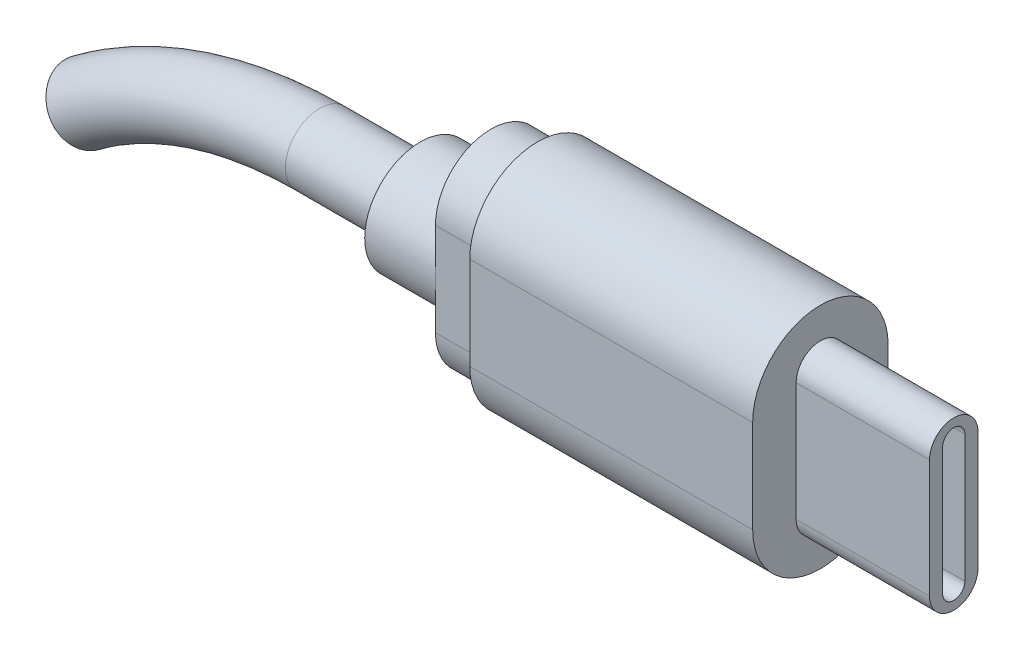
ISO-10303-21;
HEADER;
FILE_DESCRIPTION(('STEP AP214'),'2;1');
FILE_NAME('part.step','',(''),(''),'','','');
FILE_SCHEMA(('AUTOMOTIVE_DESIGN { 1 0 10303 214 1 1 1 1 }'));
ENDSEC;
DATA;
#1=APPLICATION_CONTEXT('core data for automotive mechanical design processes');
#2=APPLICATION_PROTOCOL_DEFINITION('international standard','automotive_design',2000,#1);
#3=PRODUCT_CONTEXT('',#1,'mechanical');
#4=PRODUCT('Part','Part','',(#3));
#5=PRODUCT_RELATED_PRODUCT_CATEGORY('part','',(#4));
#6=PRODUCT_DEFINITION_FORMATION('','',#4);
#7=PRODUCT_DEFINITION_CONTEXT('part definition',#1,'design');
#8=PRODUCT_DEFINITION('design','',#6,#7);
#9=PRODUCT_DEFINITION_SHAPE('','',#8);
#10=(LENGTH_UNIT() NAMED_UNIT(*) SI_UNIT(.MILLI.,.METRE.));
#11=(NAMED_UNIT(*) PLANE_ANGLE_UNIT() SI_UNIT($,.RADIAN.));
#12=(NAMED_UNIT(*) SI_UNIT($,.STERADIAN.) SOLID_ANGLE_UNIT());
#13=UNCERTAINTY_MEASURE_WITH_UNIT(LENGTH_MEASURE(1.E-05),#10,'distance_accuracy_value','');
#14=(GEOMETRIC_REPRESENTATION_CONTEXT(3) GLOBAL_UNCERTAINTY_ASSIGNED_CONTEXT((#13)) GLOBAL_UNIT_ASSIGNED_CONTEXT((#10,
#11,#12)) REPRESENTATION_CONTEXT('',''));
#15=CARTESIAN_POINT('',(0.,0.,0.));
#16=DIRECTION('',(0.,0.,1.));
#17=DIRECTION('',(1.,0.,0.));
#18=AXIS2_PLACEMENT_3D('',#15,#16,#17);
#19=CARTESIAN_POINT('',(0.,-2.3,0.));
#20=DIRECTION('',(1.,0.,0.));
#21=DIRECTION('',(0.,0.,-1.));
#22=AXIS2_PLACEMENT_3D('',#19,#20,#21);
#23=PLANE('',#22);
#24=CARTESIAN_POINT('',(0.,-2.3,0.));
#25=DIRECTION('',(1.,0.,0.));
#26=DIRECTION('',(0.,0.,-1.));
#27=AXIS2_PLACEMENT_3D('',#24,#25,#26);
#28=CIRCLE('',#27,3.35);
#29=CARTESIAN_POINT('',(0.,-2.3,3.35));
#30=VERTEX_POINT('',#29);
#31=CARTESIAN_POINT('',(0.,-2.3,-3.35));
#32=VERTEX_POINT('',#31);
#33=EDGE_CURVE('E253',#30,#32,#28,.T.);
#34=ORIENTED_EDGE('',*,*,#33,.T.);
#35=DIRECTION('',(0.,1.,0.));
#36=VECTOR('',#35,1.);
#37=CARTESIAN_POINT('',(0.,-2.3,-3.35));
#38=LINE('',#37,#36);
#39=CARTESIAN_POINT('',(0.,2.3,-3.35));
#40=VERTEX_POINT('',#39);
#41=EDGE_CURVE('E294',#32,#40,#38,.T.);
#42=ORIENTED_EDGE('',*,*,#41,.T.);
#43=CARTESIAN_POINT('',(0.,2.3,0.));
#44=DIRECTION('',(1.,0.,0.));
#45=DIRECTION('',(0.,0.,-1.));
#46=AXIS2_PLACEMENT_3D('',#43,#44,#45);
#47=CIRCLE('',#46,3.35);
#48=CARTESIAN_POINT('',(0.,2.3,3.35));
#49=VERTEX_POINT('',#48);
#50=EDGE_CURVE('E297',#40,#49,#47,.T.);
#51=ORIENTED_EDGE('',*,*,#50,.T.);
#52=DIRECTION('',(0.,-1.,0.));
#53=VECTOR('',#52,1.);
#54=CARTESIAN_POINT('',(0.,-2.3,3.35));
#55=LINE('',#54,#53);
#56=EDGE_CURVE('E283',#49,#30,#55,.T.);
#57=ORIENTED_EDGE('',*,*,#56,.T.);
#58=EDGE_LOOP('',(#34,#42,#51,#57));
#59=FACE_BOUND('',#58,.T.);
#60=DIRECTION('',(0.,1.,0.));
#61=VECTOR('',#60,1.);
#62=CARTESIAN_POINT('',(0.,-2.925,-1.2));
#63=LINE('',#62,#61);
#64=CARTESIAN_POINT('',(0.,-2.925,-1.2));
#65=VERTEX_POINT('',#64);
#66=CARTESIAN_POINT('',(0.,2.925,-1.2));
#67=VERTEX_POINT('',#66);
#68=EDGE_CURVE('E217',#65,#67,#63,.T.);
#69=ORIENTED_EDGE('',*,*,#68,.F.);
#70=CARTESIAN_POINT('',(0.,-2.925,0.));
#71=DIRECTION('',(1.,0.,0.));
#72=DIRECTION('',(0.,0.,-1.));
#73=AXIS2_PLACEMENT_3D('',#70,#71,#72);
#74=CIRCLE('',#73,1.2);
#75=CARTESIAN_POINT('',(0.,-2.925,1.2));
#76=VERTEX_POINT('',#75);
#77=EDGE_CURVE('E182',#76,#65,#74,.T.);
#78=ORIENTED_EDGE('',*,*,#77,.F.);
#79=DIRECTION('',(0.,-1.,0.));
#80=VECTOR('',#79,1.);
#81=CARTESIAN_POINT('',(0.,-2.925,1.2));
#82=LINE('',#81,#80);
#83=CARTESIAN_POINT('',(0.,2.925,1.2));
#84=VERTEX_POINT('',#83);
#85=EDGE_CURVE('E208',#84,#76,#82,.T.);
#86=ORIENTED_EDGE('',*,*,#85,.F.);
#87=CARTESIAN_POINT('',(0.,2.925,0.));
#88=DIRECTION('',(1.,0.,0.));
#89=DIRECTION('',(0.,0.,-1.));
#90=AXIS2_PLACEMENT_3D('',#87,#88,#89);
#91=CIRCLE('',#90,1.2);
#92=EDGE_CURVE('E219',#67,#84,#91,.T.);
#93=ORIENTED_EDGE('',*,*,#92,.F.);
#94=EDGE_LOOP('',(#69,#78,#86,#93));
#95=FACE_BOUND('',#94,.T.);
#96=ADVANCED_FACE('F39',(#59,#95),#23,.T.);
#97=CARTESIAN_POINT('',(-16.3,-2.3,0.));
#98=DIRECTION('',(1.,0.,0.));
#99=DIRECTION('',(0.,0.,-1.));
#100=AXIS2_PLACEMENT_3D('',#97,#98,#99);
#101=PLANE('',#100);
#102=CARTESIAN_POINT('',(-16.3,0.,0.));
#103=DIRECTION('',(-1.,0.,0.));
#104=DIRECTION('',(0.,0.,1.));
#105=AXIS2_PLACEMENT_3D('',#102,#103,#104);
#106=CIRCLE('',#105,2.75);
#107=CARTESIAN_POINT('',(-16.3,0.,2.75));
#108=VERTEX_POINT('',#107);
#109=CARTESIAN_POINT('',(-16.3,0.,-2.75));
#110=VERTEX_POINT('',#109);
#111=EDGE_CURVE('E235',#108,#110,#106,.T.);
#112=ORIENTED_EDGE('',*,*,#111,.F.);
#113=DIRECTION('',(0.,-1.,0.));
#114=VECTOR('',#113,1.);
#115=CARTESIAN_POINT('',(-16.3,2.3,2.75));
#116=LINE('',#115,#114);
#117=CARTESIAN_POINT('',(-16.3,2.3,2.75));
#118=VERTEX_POINT('',#117);
#119=EDGE_CURVE('E246',#118,#108,#116,.T.);
#120=ORIENTED_EDGE('',*,*,#119,.F.);
#121=CARTESIAN_POINT('',(-16.3,2.3,0.));
#122=DIRECTION('',(1.,0.,0.));
#123=DIRECTION('',(0.,0.,-1.));
#124=AXIS2_PLACEMENT_3D('',#121,#122,#123);
#125=CIRCLE('',#124,2.75);
#126=CARTESIAN_POINT('',(-16.3,2.3,-2.75));
#127=VERTEX_POINT('',#126);
#128=EDGE_CURVE('E250',#127,#118,#125,.T.);
#129=ORIENTED_EDGE('',*,*,#128,.F.);
#130=DIRECTION('',(0.,1.,0.));
#131=VECTOR('',#130,1.);
#132=CARTESIAN_POINT('',(-16.3,2.3,-2.75));
#133=LINE('',#132,#131);
#134=EDGE_CURVE('E245',#110,#127,#133,.T.);
#135=ORIENTED_EDGE('',*,*,#134,.F.);
#136=EDGE_LOOP('',(#112,#120,#129,#135));
#137=FACE_BOUND('',#136,.T.);
#138=ADVANCED_FACE('F335',(#137),#101,.F.);
#139=CARTESIAN_POINT('',(-14.,-2.3,0.));
#140=DIRECTION('',(1.,0.,0.));
#141=DIRECTION('',(0.,0.,-1.));
#142=AXIS2_PLACEMENT_3D('',#139,#140,#141);
#143=PLANE('',#142);
#144=CARTESIAN_POINT('',(-14.,-2.3,0.));
#145=DIRECTION('',(1.,0.,0.));
#146=DIRECTION('',(0.,0.,-1.));
#147=AXIS2_PLACEMENT_3D('',#144,#145,#146);
#148=CIRCLE('',#147,3.35);
#149=CARTESIAN_POINT('',(-14.,-2.3,3.35));
#150=VERTEX_POINT('',#149);
#151=CARTESIAN_POINT('',(-14.,-2.3,-3.35));
#152=VERTEX_POINT('',#151);
#153=EDGE_CURVE('E279',#150,#152,#148,.T.);
#154=ORIENTED_EDGE('',*,*,#153,.F.);
#155=DIRECTION('',(0.,-1.,0.));
#156=VECTOR('',#155,1.);
#157=CARTESIAN_POINT('',(-14.,-2.3,3.35));
#158=LINE('',#157,#156);
#159=CARTESIAN_POINT('',(-14.,2.3,3.35));
#160=VERTEX_POINT('',#159);
#161=EDGE_CURVE('E289',#160,#150,#158,.T.);
#162=ORIENTED_EDGE('',*,*,#161,.F.);
#163=CARTESIAN_POINT('',(-14.,2.3,0.));
#164=DIRECTION('',(1.,0.,0.));
#165=DIRECTION('',(0.,0.,-1.));
#166=AXIS2_PLACEMENT_3D('',#163,#164,#165);
#167=CIRCLE('',#166,3.35);
#168=CARTESIAN_POINT('',(-14.,2.3,-3.35));
#169=VERTEX_POINT('',#168);
#170=EDGE_CURVE('E286',#169,#160,#167,.T.);
#171=ORIENTED_EDGE('',*,*,#170,.F.);
#172=DIRECTION('',(0.,1.,0.));
#173=VECTOR('',#172,1.);
#174=CARTESIAN_POINT('',(-14.,-2.3,-3.35));
#175=LINE('',#174,#173);
#176=EDGE_CURVE('E282',#152,#169,#175,.T.);
#177=ORIENTED_EDGE('',*,*,#176,.F.);
#178=EDGE_LOOP('',(#154,#162,#171,#177));
#179=FACE_BOUND('',#178,.T.);
#180=CARTESIAN_POINT('',(-14.,2.3,0.));
#181=DIRECTION('',(-1.,0.,0.));
#182=DIRECTION('',(0.,0.,1.));
#183=AXIS2_PLACEMENT_3D('',#180,#181,#182);
#184=CIRCLE('',#183,2.75);
#185=CARTESIAN_POINT('',(-14.,2.3,2.75));
#186=VERTEX_POINT('',#185);
#187=CARTESIAN_POINT('',(-14.,2.3,-2.75));
#188=VERTEX_POINT('',#187);
#189=EDGE_CURVE('E239',#186,#188,#184,.T.);
#190=ORIENTED_EDGE('',*,*,#189,.F.);
#191=DIRECTION('',(0.,1.,0.));
#192=VECTOR('',#191,1.);
#193=CARTESIAN_POINT('',(-14.,2.3,2.75));
#194=LINE('',#193,#192);
#195=CARTESIAN_POINT('',(-14.,-2.3,2.75));
#196=VERTEX_POINT('',#195);
#197=EDGE_CURVE('E262',#196,#186,#194,.T.);
#198=ORIENTED_EDGE('',*,*,#197,.F.);
#199=CARTESIAN_POINT('',(-14.,-2.3,0.));
#200=DIRECTION('',(-1.,0.,0.));
#201=DIRECTION('',(0.,0.,1.));
#202=AXIS2_PLACEMENT_3D('',#199,#200,#201);
#203=CIRCLE('',#202,2.75);
#204=CARTESIAN_POINT('',(-14.,-2.3,-2.75));
#205=VERTEX_POINT('',#204);
#206=EDGE_CURVE('E259',#205,#196,#203,.T.);
#207=ORIENTED_EDGE('',*,*,#206,.F.);
#208=DIRECTION('',(0.,-1.,0.));
#209=VECTOR('',#208,1.);
#210=CARTESIAN_POINT('',(-14.,2.3,-2.75));
#211=LINE('',#210,#209);
#212=EDGE_CURVE('E256',#188,#205,#211,.T.);
#213=ORIENTED_EDGE('',*,*,#212,.F.);
#214=EDGE_LOOP('',(#190,#198,#207,#213));
#215=FACE_BOUND('',#214,.T.);
#216=ADVANCED_FACE('F321',(#179,#215),#143,.F.);
#217=CARTESIAN_POINT('',(-14.,-2.3,0.));
#218=DIRECTION('',(1.,0.,0.));
#219=DIRECTION('',(0.,0.,-1.));
#220=AXIS2_PLACEMENT_3D('',#217,#218,#219);
#221=CYLINDRICAL_SURFACE('',#220,3.35);
#222=ORIENTED_EDGE('',*,*,#33,.F.);
#223=DIRECTION('',(1.,0.,0.));
#224=VECTOR('',#223,1.);
#225=CARTESIAN_POINT('',(-14.,-2.3,3.35));
#226=LINE('',#225,#224);
#227=EDGE_CURVE('E302',#150,#30,#226,.T.);
#228=ORIENTED_EDGE('',*,*,#227,.F.);
#229=ORIENTED_EDGE('',*,*,#153,.T.);
#230=DIRECTION('',(1.,0.,0.));
#231=VECTOR('',#230,1.);
#232=CARTESIAN_POINT('',(-14.,-2.3,-3.35));
#233=LINE('',#232,#231);
#234=EDGE_CURVE('E43',#152,#32,#233,.T.);
#235=ORIENTED_EDGE('',*,*,#234,.T.);
#236=EDGE_LOOP('',(#222,#228,#229,#235));
#237=FACE_BOUND('',#236,.T.);
#238=ADVANCED_FACE('F41',(#237),#221,.T.);
#239=CARTESIAN_POINT('',(-14.,-2.3,3.35));
#240=DIRECTION('',(0.,0.,1.));
#241=DIRECTION('',(0.,-1.,0.));
#242=AXIS2_PLACEMENT_3D('',#239,#240,#241);
#243=PLANE('',#242);
#244=ORIENTED_EDGE('',*,*,#56,.F.);
#245=DIRECTION('',(1.,0.,0.));
#246=VECTOR('',#245,1.);
#247=CARTESIAN_POINT('',(-14.,2.3,3.35));
#248=LINE('',#247,#246);
#249=EDGE_CURVE('E304',#160,#49,#248,.T.);
#250=ORIENTED_EDGE('',*,*,#249,.F.);
#251=ORIENTED_EDGE('',*,*,#161,.T.);
#252=ORIENTED_EDGE('',*,*,#227,.T.);
#253=EDGE_LOOP('',(#244,#250,#251,#252));
#254=FACE_BOUND('',#253,.T.);
#255=ADVANCED_FACE('F318',(#254),#243,.T.);
#256=CARTESIAN_POINT('',(-14.,2.3,0.));
#257=DIRECTION('',(1.,0.,0.));
#258=DIRECTION('',(0.,0.,-1.));
#259=AXIS2_PLACEMENT_3D('',#256,#257,#258);
#260=CYLINDRICAL_SURFACE('',#259,3.35);
#261=ORIENTED_EDGE('',*,*,#50,.F.);
#262=DIRECTION('',(1.,0.,0.));
#263=VECTOR('',#262,1.);
#264=CARTESIAN_POINT('',(-14.,2.3,-3.35));
#265=LINE('',#264,#263);
#266=EDGE_CURVE('E305',#169,#40,#265,.T.);
#267=ORIENTED_EDGE('',*,*,#266,.F.);
#268=ORIENTED_EDGE('',*,*,#170,.T.);
#269=ORIENTED_EDGE('',*,*,#249,.T.);
#270=EDGE_LOOP('',(#261,#267,#268,#269));
#271=FACE_BOUND('',#270,.T.);
#272=ADVANCED_FACE('F325',(#271),#260,.T.);
#273=CARTESIAN_POINT('',(-14.,-2.3,-3.35));
#274=DIRECTION('',(0.,0.,-1.));
#275=DIRECTION('',(0.,1.,0.));
#276=AXIS2_PLACEMENT_3D('',#273,#274,#275);
#277=PLANE('',#276);
#278=ORIENTED_EDGE('',*,*,#41,.F.);
#279=ORIENTED_EDGE('',*,*,#234,.F.);
#280=ORIENTED_EDGE('',*,*,#176,.T.);
#281=ORIENTED_EDGE('',*,*,#266,.T.);
#282=EDGE_LOOP('',(#278,#279,#280,#281));
#283=FACE_BOUND('',#282,.T.);
#284=ADVANCED_FACE('F313',(#283),#277,.T.);
#285=CARTESIAN_POINT('',(-44.1004347743901,2.3,2.75));
#286=DIRECTION('',(0.,0.,-1.));
#287=DIRECTION('',(0.,1.,0.));
#288=AXIS2_PLACEMENT_3D('',#285,#286,#287);
#289=PLANE('',#288);
#290=DIRECTION('',(1.,0.,0.));
#291=VECTOR('',#290,1.);
#292=CARTESIAN_POINT('',(-44.1004347743901,2.3,2.75));
#293=LINE('',#292,#291);
#294=EDGE_CURVE('E265',#118,#186,#293,.T.);
#295=ORIENTED_EDGE('',*,*,#294,.F.);
#296=ORIENTED_EDGE('',*,*,#119,.T.);
#297=CARTESIAN_POINT('',(-16.3,-2.3,2.75));
#298=VERTEX_POINT('',#297);
#299=EDGE_CURVE('E277',#108,#298,#116,.T.);
#300=ORIENTED_EDGE('',*,*,#299,.T.);
#301=DIRECTION('',(1.,0.,0.));
#302=VECTOR('',#301,1.);
#303=CARTESIAN_POINT('',(-44.1004347743901,-2.3,2.75));
#304=LINE('',#303,#302);
#305=EDGE_CURVE('E268',#298,#196,#304,.T.);
#306=ORIENTED_EDGE('',*,*,#305,.T.);
#307=ORIENTED_EDGE('',*,*,#197,.T.);
#308=EDGE_LOOP('',(#295,#296,#300,#306,#307));
#309=FACE_BOUND('',#308,.T.);
#310=ADVANCED_FACE('F332',(#309),#289,.F.);
#311=CARTESIAN_POINT('',(-44.1004347743901,-2.3,0.));
#312=DIRECTION('',(1.,0.,0.));
#313=DIRECTION('',(0.,0.,-1.));
#314=AXIS2_PLACEMENT_3D('',#311,#312,#313);
#315=CYLINDRICAL_SURFACE('',#314,2.75);
#316=ORIENTED_EDGE('',*,*,#305,.F.);
#317=CARTESIAN_POINT('',(-16.3,-2.3,0.));
#318=DIRECTION('',(1.,0.,0.));
#319=DIRECTION('',(0.,0.,-1.));
#320=AXIS2_PLACEMENT_3D('',#317,#318,#319);
#321=CIRCLE('',#320,2.75);
#322=CARTESIAN_POINT('',(-16.3,-2.3,-2.75));
#323=VERTEX_POINT('',#322);
#324=EDGE_CURVE('E242',#298,#323,#321,.T.);
#325=ORIENTED_EDGE('',*,*,#324,.T.);
#326=DIRECTION('',(1.,0.,0.));
#327=VECTOR('',#326,1.);
#328=CARTESIAN_POINT('',(-44.1004347743901,-2.3,-2.75));
#329=LINE('',#328,#327);
#330=EDGE_CURVE('E271',#323,#205,#329,.T.);
#331=ORIENTED_EDGE('',*,*,#330,.T.);
#332=ORIENTED_EDGE('',*,*,#206,.T.);
#333=EDGE_LOOP('',(#316,#325,#331,#332));
#334=FACE_BOUND('',#333,.T.);
#335=ADVANCED_FACE('F407',(#334),#315,.T.);
#336=CARTESIAN_POINT('',(-44.1004347743901,2.3,-2.75));
#337=DIRECTION('',(0.,0.,1.));
#338=DIRECTION('',(0.,-1.,0.));
#339=AXIS2_PLACEMENT_3D('',#336,#337,#338);
#340=PLANE('',#339);
#341=ORIENTED_EDGE('',*,*,#330,.F.);
#342=EDGE_CURVE('E247',#323,#110,#133,.T.);
#343=ORIENTED_EDGE('',*,*,#342,.T.);
#344=ORIENTED_EDGE('',*,*,#134,.T.);
#345=DIRECTION('',(1.,0.,0.));
#346=VECTOR('',#345,1.);
#347=CARTESIAN_POINT('',(-44.1004347743901,2.3,-2.75));
#348=LINE('',#347,#346);
#349=EDGE_CURVE('E274',#127,#188,#348,.T.);
#350=ORIENTED_EDGE('',*,*,#349,.T.);
#351=ORIENTED_EDGE('',*,*,#212,.T.);
#352=EDGE_LOOP('',(#341,#343,#344,#350,#351));
#353=FACE_BOUND('',#352,.T.);
#354=ADVANCED_FACE('F411',(#353),#340,.F.);
#355=CARTESIAN_POINT('',(-44.1004347743901,2.3,0.));
#356=DIRECTION('',(1.,0.,0.));
#357=DIRECTION('',(0.,0.,-1.));
#358=AXIS2_PLACEMENT_3D('',#355,#356,#357);
#359=CYLINDRICAL_SURFACE('',#358,2.75);
#360=ORIENTED_EDGE('',*,*,#349,.F.);
#361=ORIENTED_EDGE('',*,*,#128,.T.);
#362=ORIENTED_EDGE('',*,*,#294,.T.);
#363=ORIENTED_EDGE('',*,*,#189,.T.);
#364=EDGE_LOOP('',(#360,#361,#362,#363));
#365=FACE_BOUND('',#364,.T.);
#366=ADVANCED_FACE('F403',(#365),#359,.T.);
#367=EDGE_CURVE('E48',#110,#108,#106,.T.);
#368=ORIENTED_EDGE('',*,*,#367,.F.);
#369=ORIENTED_EDGE('',*,*,#342,.F.);
#370=ORIENTED_EDGE('',*,*,#324,.F.);
#371=ORIENTED_EDGE('',*,*,#299,.F.);
#372=EDGE_LOOP('',(#368,#369,#370,#371));
#373=FACE_BOUND('',#372,.T.);
#374=ADVANCED_FACE('F343',(#373),#101,.F.);
#375=CARTESIAN_POINT('',(-19.8,0.,0.));
#376=DIRECTION('',(1.,0.,0.));
#377=DIRECTION('',(0.,0.,-1.));
#378=AXIS2_PLACEMENT_3D('',#375,#376,#377);
#379=CYLINDRICAL_SURFACE('',#378,2.75);
#380=CARTESIAN_POINT('',(-19.8,0.,0.));
#381=DIRECTION('',(-1.,0.,0.));
#382=DIRECTION('',(0.,0.,1.));
#383=AXIS2_PLACEMENT_3D('',#380,#381,#382);
#384=CIRCLE('',#383,2.75);
#385=CARTESIAN_POINT('',(-19.8,0.,2.75));
#386=VERTEX_POINT('',#385);
#387=EDGE_CURVE('E236',#386,#386,#384,.T.);
#388=ORIENTED_EDGE('',*,*,#387,.F.);
#389=EDGE_LOOP('',(#388));
#390=FACE_BOUND('',#389,.T.);
#391=ORIENTED_EDGE('',*,*,#111,.T.);
#392=ORIENTED_EDGE('',*,*,#367,.T.);
#393=EDGE_LOOP('',(#391,#392));
#394=FACE_BOUND('',#393,.T.);
#395=ADVANCED_FACE('F397',(#390,#394),#379,.T.);
#396=CARTESIAN_POINT('',(-19.8,0.,0.));
#397=DIRECTION('',(-1.,0.,0.));
#398=DIRECTION('',(0.,0.,1.));
#399=AXIS2_PLACEMENT_3D('',#396,#397,#398);
#400=PLANE('',#399);
#401=CARTESIAN_POINT('',(-19.8,0.,0.));
#402=DIRECTION('',(-1.,0.,0.));
#403=DIRECTION('',(0.,0.,1.));
#404=AXIS2_PLACEMENT_3D('',#401,#402,#403);
#405=CIRCLE('',#404,1.7);
#406=CARTESIAN_POINT('',(-19.8,0.,1.7));
#407=VERTEX_POINT('',#406);
#408=EDGE_CURVE('E12',#407,#407,#405,.T.);
#409=ORIENTED_EDGE('',*,*,#408,.F.);
#410=EDGE_LOOP('',(#409));
#411=FACE_BOUND('',#410,.T.);
#412=ORIENTED_EDGE('',*,*,#387,.T.);
#413=EDGE_LOOP('',(#412));
#414=FACE_BOUND('',#413,.T.);
#415=ADVANCED_FACE('F391',(#411,#414),#400,.T.);
#416=CARTESIAN_POINT('',(-36.3421818285019,-3.84559105512494,0.));
#417=DIRECTION('',(-0.800909636192724,-0.598785232494622,0.));
#418=DIRECTION('',(0.,0.,1.));
#419=AXIS2_PLACEMENT_3D('',#416,#417,#418);
#420=PLANE('',#419);
#421=CARTESIAN_POINT('',(-36.3421818285019,-3.84559105512494,0.));
#422=DIRECTION('',(-0.800909636192724,-0.598785232494622,0.));
#423=DIRECTION('',(0.,0.,1.));
#424=AXIS2_PLACEMENT_3D('',#421,#422,#423);
#425=CIRCLE('',#424,1.7);
#426=CARTESIAN_POINT('',(-36.3421818285019,-3.84559105512494,1.7));
#427=VERTEX_POINT('',#426);
#428=EDGE_CURVE('E233',#427,#427,#425,.T.);
#429=ORIENTED_EDGE('',*,*,#428,.T.);
#430=EDGE_LOOP('',(#429));
#431=FACE_BOUND('',#430,.T.);
#432=ADVANCED_FACE('F370',(#431),#420,.T.);
#433=CARTESIAN_POINT('',(-19.8,0.,0.));
#434=DIRECTION('',(-1.,0.,0.));
#435=DIRECTION('',(0.,0.,1.));
#436=AXIS2_PLACEMENT_3D('',#433,#434,#435);
#437=CYLINDRICAL_SURFACE('',#436,1.7);
#438=CARTESIAN_POINT('',(-24.7761618063009,0.,0.));
#439=DIRECTION('',(-1.,0.,0.));
#440=DIRECTION('',(0.,0.,1.));
#441=AXIS2_PLACEMENT_3D('',#438,#439,#440);
#442=CIRCLE('',#441,1.7);
#443=CARTESIAN_POINT('',(-24.7761618063009,0.,1.7));
#444=VERTEX_POINT('',#443);
#445=EDGE_CURVE('E229',#444,#444,#442,.T.);
#446=ORIENTED_EDGE('',*,*,#445,.F.);
#447=EDGE_LOOP('',(#446));
#448=FACE_BOUND('',#447,.T.);
#449=ORIENTED_EDGE('',*,*,#408,.T.);
#450=EDGE_LOOP('',(#449));
#451=FACE_BOUND('',#450,.T.);
#452=ADVANCED_FACE('F384',(#448,#451),#437,.T.);
#453=CARTESIAN_POINT('',(-24.7761618063009,-19.3158070615993,0.));
#454=DIRECTION('',(0.,0.,1.));
#455=DIRECTION('',(1.,0.,0.));
#456=AXIS2_PLACEMENT_3D('',#453,#454,#455);
#457=TOROIDAL_SURFACE('',#456,19.3158070615993,1.7);
#458=ORIENTED_EDGE('',*,*,#428,.F.);
#459=EDGE_LOOP('',(#458));
#460=FACE_BOUND('',#459,.T.);
#461=ORIENTED_EDGE('',*,*,#445,.T.);
#462=EDGE_LOOP('',(#461));
#463=FACE_BOUND('',#462,.T.);
#464=ADVANCED_FACE('F368',(#460,#463),#457,.T.);
#465=CARTESIAN_POINT('',(6.6,-2.925,0.));
#466=DIRECTION('',(1.,0.,0.));
#467=DIRECTION('',(0.,0.,-1.));
#468=AXIS2_PLACEMENT_3D('',#465,#466,#467);
#469=PLANE('',#468);
#470=CARTESIAN_POINT('',(6.6,-2.925,0.));
#471=DIRECTION('',(1.,0.,0.));
#472=DIRECTION('',(0.,0.,-1.));
#473=AXIS2_PLACEMENT_3D('',#470,#471,#472);
#474=CIRCLE('',#473,1.2);
#475=CARTESIAN_POINT('',(6.6,-2.925,1.2));
#476=VERTEX_POINT('',#475);
#477=CARTESIAN_POINT('',(6.6,-2.925,-1.2));
#478=VERTEX_POINT('',#477);
#479=EDGE_CURVE('E204',#476,#478,#474,.T.);
#480=ORIENTED_EDGE('',*,*,#479,.T.);
#481=DIRECTION('',(0.,1.,0.));
#482=VECTOR('',#481,1.);
#483=CARTESIAN_POINT('',(6.6,-2.925,-1.2));
#484=LINE('',#483,#482);
#485=CARTESIAN_POINT('',(6.6,2.925,-1.2));
#486=VERTEX_POINT('',#485);
#487=EDGE_CURVE('E207',#478,#486,#484,.T.);
#488=ORIENTED_EDGE('',*,*,#487,.T.);
#489=CARTESIAN_POINT('',(6.6,2.925,0.));
#490=DIRECTION('',(1.,0.,0.));
#491=DIRECTION('',(0.,0.,-1.));
#492=AXIS2_PLACEMENT_3D('',#489,#490,#491);
#493=CIRCLE('',#492,1.2);
#494=CARTESIAN_POINT('',(6.6,2.925,1.2));
#495=VERTEX_POINT('',#494);
#496=EDGE_CURVE('E210',#486,#495,#493,.T.);
#497=ORIENTED_EDGE('',*,*,#496,.T.);
#498=DIRECTION('',(0.,-1.,0.));
#499=VECTOR('',#498,1.);
#500=CARTESIAN_POINT('',(6.6,-2.925,1.2));
#501=LINE('',#500,#499);
#502=EDGE_CURVE('E212',#495,#476,#501,.T.);
#503=ORIENTED_EDGE('',*,*,#502,.T.);
#504=EDGE_LOOP('',(#480,#488,#497,#503));
#505=FACE_BOUND('',#504,.T.);
#506=DIRECTION('',(0.,1.,0.));
#507=VECTOR('',#506,1.);
#508=CARTESIAN_POINT('',(6.6,-3.15,-0.550000000000001));
#509=LINE('',#508,#507);
#510=CARTESIAN_POINT('',(6.6,-3.15,-0.550000000000001));
#511=VERTEX_POINT('',#510);
#512=CARTESIAN_POINT('',(6.6,3.15,-0.55));
#513=VERTEX_POINT('',#512);
#514=EDGE_CURVE('E174',#511,#513,#509,.T.);
#515=ORIENTED_EDGE('',*,*,#514,.F.);
#516=CARTESIAN_POINT('',(6.6,-3.15,0.));
#517=DIRECTION('',(1.,0.,0.));
#518=DIRECTION('',(0.,0.,-1.));
#519=AXIS2_PLACEMENT_3D('',#516,#517,#518);
#520=CIRCLE('',#519,0.55);
#521=CARTESIAN_POINT('',(6.6,-3.15,0.549999999999999));
#522=VERTEX_POINT('',#521);
#523=EDGE_CURVE('E165',#522,#511,#520,.T.);
#524=ORIENTED_EDGE('',*,*,#523,.F.);
#525=DIRECTION('',(0.,-1.,0.));
#526=VECTOR('',#525,1.);
#527=CARTESIAN_POINT('',(6.6,-3.15,0.549999999999999));
#528=LINE('',#527,#526);
#529=CARTESIAN_POINT('',(6.6,3.15,0.55));
#530=VERTEX_POINT('',#529);
#531=EDGE_CURVE('E190',#530,#522,#528,.T.);
#532=ORIENTED_EDGE('',*,*,#531,.F.);
#533=CARTESIAN_POINT('',(6.6,3.15,0.));
#534=DIRECTION('',(1.,0.,0.));
#535=DIRECTION('',(0.,0.,-1.));
#536=AXIS2_PLACEMENT_3D('',#533,#534,#535);
#537=CIRCLE('',#536,0.55);
#538=EDGE_CURVE('E188',#513,#530,#537,.T.);
#539=ORIENTED_EDGE('',*,*,#538,.F.);
#540=EDGE_LOOP('',(#515,#524,#532,#539));
#541=FACE_BOUND('',#540,.T.);
#542=ADVANCED_FACE('F186',(#505,#541),#469,.T.);
#543=CARTESIAN_POINT('',(6.6,-2.925,0.));
#544=DIRECTION('',(-1.,0.,0.));
#545=DIRECTION('',(0.,0.,1.));
#546=AXIS2_PLACEMENT_3D('',#543,#544,#545);
#547=CYLINDRICAL_SURFACE('',#546,1.2);
#548=ORIENTED_EDGE('',*,*,#77,.T.);
#549=DIRECTION('',(-1.,0.,0.));
#550=VECTOR('',#549,1.);
#551=CARTESIAN_POINT('',(6.6,-2.925,-1.2));
#552=LINE('',#551,#550);
#553=EDGE_CURVE('E228',#478,#65,#552,.T.);
#554=ORIENTED_EDGE('',*,*,#553,.F.);
#555=ORIENTED_EDGE('',*,*,#479,.F.);
#556=DIRECTION('',(-1.,0.,0.));
#557=VECTOR('',#556,1.);
#558=CARTESIAN_POINT('',(6.6,-2.925,1.2));
#559=LINE('',#558,#557);
#560=EDGE_CURVE('E214',#476,#76,#559,.T.);
#561=ORIENTED_EDGE('',*,*,#560,.T.);
#562=EDGE_LOOP('',(#548,#554,#555,#561));
#563=FACE_BOUND('',#562,.T.);
#564=ADVANCED_FACE('F367',(#563),#547,.T.);
#565=CARTESIAN_POINT('',(6.6,-2.925,-1.2));
#566=DIRECTION('',(0.,0.,1.));
#567=DIRECTION('',(0.,-1.,0.));
#568=AXIS2_PLACEMENT_3D('',#565,#566,#567);
#569=PLANE('',#568);
#570=ORIENTED_EDGE('',*,*,#68,.T.);
#571=DIRECTION('',(-1.,0.,0.));
#572=VECTOR('',#571,1.);
#573=CARTESIAN_POINT('',(6.6,2.925,-1.2));
#574=LINE('',#573,#572);
#575=EDGE_CURVE('E225',#486,#67,#574,.T.);
#576=ORIENTED_EDGE('',*,*,#575,.F.);
#577=ORIENTED_EDGE('',*,*,#487,.F.);
#578=ORIENTED_EDGE('',*,*,#553,.T.);
#579=EDGE_LOOP('',(#570,#576,#577,#578));
#580=FACE_BOUND('',#579,.T.);
#581=ADVANCED_FACE('F376',(#580),#569,.F.);
#582=CARTESIAN_POINT('',(6.6,2.925,0.));
#583=DIRECTION('',(-1.,0.,0.));
#584=DIRECTION('',(0.,0.,1.));
#585=AXIS2_PLACEMENT_3D('',#582,#583,#584);
#586=CYLINDRICAL_SURFACE('',#585,1.2);
#587=ORIENTED_EDGE('',*,*,#92,.T.);
#588=DIRECTION('',(-1.,0.,0.));
#589=VECTOR('',#588,1.);
#590=CARTESIAN_POINT('',(6.6,2.925,1.2));
#591=LINE('',#590,#589);
#592=EDGE_CURVE('E56',#495,#84,#591,.T.);
#593=ORIENTED_EDGE('',*,*,#592,.F.);
#594=ORIENTED_EDGE('',*,*,#496,.F.);
#595=ORIENTED_EDGE('',*,*,#575,.T.);
#596=EDGE_LOOP('',(#587,#593,#594,#595));
#597=FACE_BOUND('',#596,.T.);
#598=ADVANCED_FACE('F373',(#597),#586,.T.);
#599=CARTESIAN_POINT('',(6.6,-2.925,1.2));
#600=DIRECTION('',(0.,0.,-1.));
#601=DIRECTION('',(0.,1.,0.));
#602=AXIS2_PLACEMENT_3D('',#599,#600,#601);
#603=PLANE('',#602);
#604=ORIENTED_EDGE('',*,*,#85,.T.);
#605=ORIENTED_EDGE('',*,*,#560,.F.);
#606=ORIENTED_EDGE('',*,*,#502,.F.);
#607=ORIENTED_EDGE('',*,*,#592,.T.);
#608=EDGE_LOOP('',(#604,#605,#606,#607));
#609=FACE_BOUND('',#608,.T.);
#610=ADVANCED_FACE('F364',(#609),#603,.F.);
#611=CARTESIAN_POINT('',(6.6,-3.15,0.));
#612=DIRECTION('',(-1.,0.,0.));
#613=DIRECTION('',(0.,0.,1.));
#614=AXIS2_PLACEMENT_3D('',#611,#612,#613);
#615=CYLINDRICAL_SURFACE('',#614,0.55);
#616=CARTESIAN_POINT('',(0.,-3.15,0.));
#617=DIRECTION('',(1.,0.,0.));
#618=DIRECTION('',(0.,0.,-1.));
#619=AXIS2_PLACEMENT_3D('',#616,#617,#618);
#620=CIRCLE('',#619,0.55);
#621=CARTESIAN_POINT('',(0.,-3.15,0.549999999999999));
#622=VERTEX_POINT('',#621);
#623=CARTESIAN_POINT('',(0.,-3.15,-0.550000000000001));
#624=VERTEX_POINT('',#623);
#625=EDGE_CURVE('E64',#622,#624,#620,.T.);
#626=ORIENTED_EDGE('',*,*,#625,.F.);
#627=DIRECTION('',(-1.,0.,0.));
#628=VECTOR('',#627,1.);
#629=CARTESIAN_POINT('',(6.6,-3.15,0.549999999999999));
#630=LINE('',#629,#628);
#631=EDGE_CURVE('E170',#522,#622,#630,.T.);
#632=ORIENTED_EDGE('',*,*,#631,.F.);
#633=ORIENTED_EDGE('',*,*,#523,.T.);
#634=DIRECTION('',(-1.,0.,0.));
#635=VECTOR('',#634,1.);
#636=CARTESIAN_POINT('',(6.6,-3.15,-0.550000000000001));
#637=LINE('',#636,#635);
#638=EDGE_CURVE('E168',#511,#624,#637,.T.);
#639=ORIENTED_EDGE('',*,*,#638,.T.);
#640=EDGE_LOOP('',(#626,#632,#633,#639));
#641=FACE_BOUND('',#640,.T.);
#642=ADVANCED_FACE('F167',(#641),#615,.F.);
#643=CARTESIAN_POINT('',(6.6,-3.15,-0.550000000000001));
#644=DIRECTION('',(0.,0.,1.));
#645=DIRECTION('',(0.,-1.,0.));
#646=AXIS2_PLACEMENT_3D('',#643,#644,#645);
#647=PLANE('',#646);
#648=DIRECTION('',(0.,1.,0.));
#649=VECTOR('',#648,1.);
#650=CARTESIAN_POINT('',(0.,-3.15,-0.550000000000001));
#651=LINE('',#650,#649);
#652=CARTESIAN_POINT('',(0.,3.15,-0.55));
#653=VERTEX_POINT('',#652);
#654=EDGE_CURVE('E181',#624,#653,#651,.T.);
#655=ORIENTED_EDGE('',*,*,#654,.F.);
#656=ORIENTED_EDGE('',*,*,#638,.F.);
#657=ORIENTED_EDGE('',*,*,#514,.T.);
#658=DIRECTION('',(-1.,0.,0.));
#659=VECTOR('',#658,1.);
#660=CARTESIAN_POINT('',(6.6,3.15,-0.55));
#661=LINE('',#660,#659);
#662=EDGE_CURVE('E183',#513,#653,#661,.T.);
#663=ORIENTED_EDGE('',*,*,#662,.T.);
#664=EDGE_LOOP('',(#655,#656,#657,#663));
#665=FACE_BOUND('',#664,.T.);
#666=ADVANCED_FACE('F178',(#665),#647,.T.);
#667=CARTESIAN_POINT('',(6.6,3.15,0.));
#668=DIRECTION('',(-1.,0.,0.));
#669=DIRECTION('',(0.,0.,1.));
#670=AXIS2_PLACEMENT_3D('',#667,#668,#669);
#671=CYLINDRICAL_SURFACE('',#670,0.55);
#672=CARTESIAN_POINT('',(0.,3.15,0.));
#673=DIRECTION('',(1.,0.,0.));
#674=DIRECTION('',(0.,0.,-1.));
#675=AXIS2_PLACEMENT_3D('',#672,#673,#674);
#676=CIRCLE('',#675,0.55);
#677=CARTESIAN_POINT('',(0.,3.15,0.55));
#678=VERTEX_POINT('',#677);
#679=EDGE_CURVE('E196',#653,#678,#676,.T.);
#680=ORIENTED_EDGE('',*,*,#679,.F.);
#681=ORIENTED_EDGE('',*,*,#662,.F.);
#682=ORIENTED_EDGE('',*,*,#538,.T.);
#683=DIRECTION('',(-1.,0.,0.));
#684=VECTOR('',#683,1.);
#685=CARTESIAN_POINT('',(6.6,3.15,0.55));
#686=LINE('',#685,#684);
#687=EDGE_CURVE('E200',#530,#678,#686,.T.);
#688=ORIENTED_EDGE('',*,*,#687,.T.);
#689=EDGE_LOOP('',(#680,#681,#682,#688));
#690=FACE_BOUND('',#689,.T.);
#691=ADVANCED_FACE('F350',(#690),#671,.F.);
#692=CARTESIAN_POINT('',(6.6,-3.15,0.549999999999999));
#693=DIRECTION('',(0.,0.,-1.));
#694=DIRECTION('',(0.,1.,0.));
#695=AXIS2_PLACEMENT_3D('',#692,#693,#694);
#696=PLANE('',#695);
#697=DIRECTION('',(0.,-1.,0.));
#698=VECTOR('',#697,1.);
#699=CARTESIAN_POINT('',(0.,-3.15,0.549999999999999));
#700=LINE('',#699,#698);
#701=EDGE_CURVE('E175',#678,#622,#700,.T.);
#702=ORIENTED_EDGE('',*,*,#701,.F.);
#703=ORIENTED_EDGE('',*,*,#687,.F.);
#704=ORIENTED_EDGE('',*,*,#531,.T.);
#705=ORIENTED_EDGE('',*,*,#631,.T.);
#706=EDGE_LOOP('',(#702,#703,#704,#705));
#707=FACE_BOUND('',#706,.T.);
#708=ADVANCED_FACE('F346',(#707),#696,.T.);
#709=ORIENTED_EDGE('',*,*,#625,.T.);
#710=ORIENTED_EDGE('',*,*,#654,.T.);
#711=ORIENTED_EDGE('',*,*,#679,.T.);
#712=ORIENTED_EDGE('',*,*,#701,.T.);
#713=EDGE_LOOP('',(#709,#710,#711,#712));
#714=FACE_BOUND('',#713,.T.);
#715=ADVANCED_FACE('F337',(#714),#23,.T.);
#716=CLOSED_SHELL('',(#96,#138,#216,#238,#255,#272,#284,#310,#335,#354,#366,#374,#395,#415,#432,
#452,#464,#542,#564,#581,#598,#610,#642,#666,#691,#708,#715));
#717=MANIFOLD_SOLID_BREP('B2',#716);
#718=ADVANCED_BREP_SHAPE_REPRESENTATION('',(#18,#717),#14);
#719=SHAPE_DEFINITION_REPRESENTATION(#9,#718);
ENDSEC;
END-ISO-10303-21;
